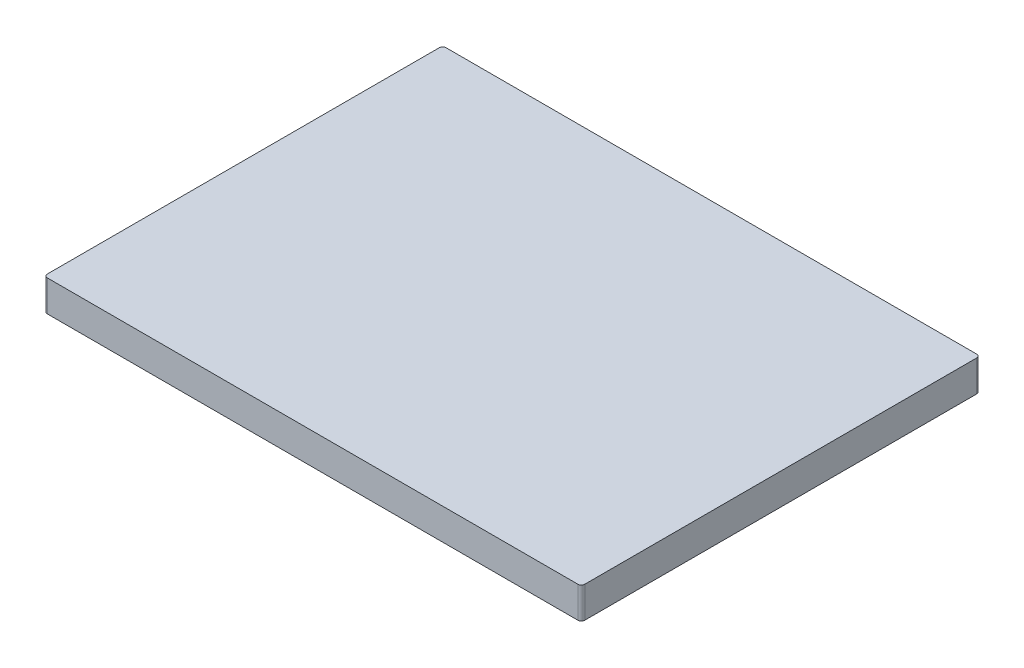
ISO-10303-21;
HEADER;
FILE_DESCRIPTION(('STEP AP214'),'2;1');
FILE_NAME('part.step','',(''),(''),'','','');
FILE_SCHEMA(('AUTOMOTIVE_DESIGN { 1 0 10303 214 1 1 1 1 }'));
ENDSEC;
DATA;
#1=APPLICATION_CONTEXT('core data for automotive mechanical design processes');
#2=APPLICATION_PROTOCOL_DEFINITION('international standard','automotive_design',2000,#1);
#3=PRODUCT_CONTEXT('',#1,'mechanical');
#4=PRODUCT('Part','Part','',(#3));
#5=PRODUCT_RELATED_PRODUCT_CATEGORY('part','',(#4));
#6=PRODUCT_DEFINITION_FORMATION('','',#4);
#7=PRODUCT_DEFINITION_CONTEXT('part definition',#1,'design');
#8=PRODUCT_DEFINITION('design','',#6,#7);
#9=PRODUCT_DEFINITION_SHAPE('','',#8);
#10=(LENGTH_UNIT() NAMED_UNIT(*) SI_UNIT(.MILLI.,.METRE.));
#11=(NAMED_UNIT(*) PLANE_ANGLE_UNIT() SI_UNIT($,.RADIAN.));
#12=(NAMED_UNIT(*) SI_UNIT($,.STERADIAN.) SOLID_ANGLE_UNIT());
#13=UNCERTAINTY_MEASURE_WITH_UNIT(LENGTH_MEASURE(1.E-05),#10,'distance_accuracy_value','');
#14=(GEOMETRIC_REPRESENTATION_CONTEXT(3) GLOBAL_UNCERTAINTY_ASSIGNED_CONTEXT((#13)) GLOBAL_UNIT_ASSIGNED_CONTEXT((#10,
#11,#12)) REPRESENTATION_CONTEXT('',''));
#15=CARTESIAN_POINT('',(0.,0.,0.));
#16=DIRECTION('',(0.,0.,1.));
#17=DIRECTION('',(1.,0.,0.));
#18=AXIS2_PLACEMENT_3D('',#15,#16,#17);
#19=CARTESIAN_POINT('',(71.5,4.,-50.5));
#20=DIRECTION('',(-1.,0.,0.));
#21=DIRECTION('',(0.,0.,1.));
#22=AXIS2_PLACEMENT_3D('',#19,#20,#21);
#23=PLANE('',#22);
#24=DIRECTION('',(0.,0.,-1.));
#25=VECTOR('',#24,1.);
#26=CARTESIAN_POINT('',(71.5,4.,-50.5));
#27=LINE('',#26,#25);
#28=CARTESIAN_POINT('',(71.5,4.,45.5));
#29=VERTEX_POINT('',#28);
#30=CARTESIAN_POINT('',(71.5,4.,-45.5));
#31=VERTEX_POINT('',#30);
#32=EDGE_CURVE('E243',#29,#31,#27,.T.);
#33=ORIENTED_EDGE('',*,*,#32,.F.);
#34=DIRECTION('',(0.,-1.,0.));
#35=VECTOR('',#34,1.);
#36=CARTESIAN_POINT('',(71.5,4.,45.5));
#37=LINE('',#36,#35);
#38=CARTESIAN_POINT('',(71.5,0.,45.5));
#39=VERTEX_POINT('',#38);
#40=EDGE_CURVE('E268',#29,#39,#37,.T.);
#41=ORIENTED_EDGE('',*,*,#40,.T.);
#42=DIRECTION('',(0.,0.,-1.));
#43=VECTOR('',#42,1.);
#44=CARTESIAN_POINT('',(71.5,0.,-50.5));
#45=LINE('',#44,#43);
#46=CARTESIAN_POINT('',(71.5,0.,-45.5));
#47=VERTEX_POINT('',#46);
#48=EDGE_CURVE('E242',#39,#47,#45,.T.);
#49=ORIENTED_EDGE('',*,*,#48,.T.);
#50=DIRECTION('',(0.,-1.,0.));
#51=VECTOR('',#50,1.);
#52=CARTESIAN_POINT('',(71.5,4.,-45.5));
#53=LINE('',#52,#51);
#54=EDGE_CURVE('E256',#47,#31,#53,.F.);
#55=ORIENTED_EDGE('',*,*,#54,.T.);
#56=EDGE_LOOP('',(#33,#41,#49,#55));
#57=FACE_BOUND('',#56,.T.);
#58=ADVANCED_FACE('F35',(#57),#23,.F.);
#59=CARTESIAN_POINT('',(-71.5,4.,-50.5));
#60=DIRECTION('',(0.,0.,1.));
#61=DIRECTION('',(1.,0.,0.));
#62=AXIS2_PLACEMENT_3D('',#59,#60,#61);
#63=PLANE('',#62);
#64=DIRECTION('',(-1.,0.,0.));
#65=VECTOR('',#64,1.);
#66=CARTESIAN_POINT('',(-71.5,4.,-50.5));
#67=LINE('',#66,#65);
#68=CARTESIAN_POINT('',(66.5,4.,-50.5));
#69=VERTEX_POINT('',#68);
#70=CARTESIAN_POINT('',(-66.5,4.,-50.5));
#71=VERTEX_POINT('',#70);
#72=EDGE_CURVE('E246',#69,#71,#67,.T.);
#73=ORIENTED_EDGE('',*,*,#72,.F.);
#74=DIRECTION('',(0.,-1.,0.));
#75=VECTOR('',#74,1.);
#76=CARTESIAN_POINT('',(66.5,4.,-50.5));
#77=LINE('',#76,#75);
#78=CARTESIAN_POINT('',(66.5,0.,-50.5));
#79=VERTEX_POINT('',#78);
#80=EDGE_CURVE('E286',#69,#79,#77,.T.);
#81=ORIENTED_EDGE('',*,*,#80,.T.);
#82=DIRECTION('',(-1.,0.,0.));
#83=VECTOR('',#82,1.);
#84=CARTESIAN_POINT('',(-71.5,0.,-50.5));
#85=LINE('',#84,#83);
#86=CARTESIAN_POINT('',(-66.5,0.,-50.5));
#87=VERTEX_POINT('',#86);
#88=EDGE_CURVE('E259',#79,#87,#85,.T.);
#89=ORIENTED_EDGE('',*,*,#88,.T.);
#90=DIRECTION('',(0.,-1.,0.));
#91=VECTOR('',#90,1.);
#92=CARTESIAN_POINT('',(-66.5,4.,-50.5));
#93=LINE('',#92,#91);
#94=EDGE_CURVE('E284',#87,#71,#93,.F.);
#95=ORIENTED_EDGE('',*,*,#94,.T.);
#96=EDGE_LOOP('',(#73,#81,#89,#95));
#97=FACE_BOUND('',#96,.T.);
#98=ADVANCED_FACE('F367',(#97),#63,.F.);
#99=CARTESIAN_POINT('',(-71.5,4.,-50.5));
#100=DIRECTION('',(1.,0.,0.));
#101=DIRECTION('',(0.,0.,-1.));
#102=AXIS2_PLACEMENT_3D('',#99,#100,#101);
#103=PLANE('',#102);
#104=DIRECTION('',(0.,0.,1.));
#105=VECTOR('',#104,1.);
#106=CARTESIAN_POINT('',(-71.5,4.,-50.5));
#107=LINE('',#106,#105);
#108=CARTESIAN_POINT('',(-71.5,4.,-45.5));
#109=VERTEX_POINT('',#108);
#110=CARTESIAN_POINT('',(-71.5,4.,45.5));
#111=VERTEX_POINT('',#110);
#112=EDGE_CURVE('E250',#109,#111,#107,.T.);
#113=ORIENTED_EDGE('',*,*,#112,.F.);
#114=DIRECTION('',(0.,-1.,0.));
#115=VECTOR('',#114,1.);
#116=CARTESIAN_POINT('',(-71.5,4.,-45.5));
#117=LINE('',#116,#115);
#118=CARTESIAN_POINT('',(-71.5,0.,-45.5));
#119=VERTEX_POINT('',#118);
#120=EDGE_CURVE('E291',#109,#119,#117,.T.);
#121=ORIENTED_EDGE('',*,*,#120,.T.);
#122=DIRECTION('',(0.,0.,1.));
#123=VECTOR('',#122,1.);
#124=CARTESIAN_POINT('',(-71.5,0.,-50.5));
#125=LINE('',#124,#123);
#126=CARTESIAN_POINT('',(-71.5,0.,45.5));
#127=VERTEX_POINT('',#126);
#128=EDGE_CURVE('E262',#119,#127,#125,.T.);
#129=ORIENTED_EDGE('',*,*,#128,.T.);
#130=DIRECTION('',(0.,-1.,0.));
#131=VECTOR('',#130,1.);
#132=CARTESIAN_POINT('',(-71.5,4.,45.5));
#133=LINE('',#132,#131);
#134=EDGE_CURVE('E289',#127,#111,#133,.F.);
#135=ORIENTED_EDGE('',*,*,#134,.T.);
#136=EDGE_LOOP('',(#113,#121,#129,#135));
#137=FACE_BOUND('',#136,.T.);
#138=ADVANCED_FACE('F373',(#137),#103,.F.);
#139=CARTESIAN_POINT('',(-71.5,4.,50.5));
#140=DIRECTION('',(0.,0.,-1.));
#141=DIRECTION('',(-1.,0.,0.));
#142=AXIS2_PLACEMENT_3D('',#139,#140,#141);
#143=PLANE('',#142);
#144=DIRECTION('',(1.,0.,0.));
#145=VECTOR('',#144,1.);
#146=CARTESIAN_POINT('',(-71.5,0.,50.5));
#147=LINE('',#146,#145);
#148=CARTESIAN_POINT('',(-66.5,0.,50.5));
#149=VERTEX_POINT('',#148);
#150=CARTESIAN_POINT('',(66.5,0.,50.5));
#151=VERTEX_POINT('',#150);
#152=EDGE_CURVE('E247',#149,#151,#147,.T.);
#153=ORIENTED_EDGE('',*,*,#152,.T.);
#154=DIRECTION('',(0.,-1.,0.));
#155=VECTOR('',#154,1.);
#156=CARTESIAN_POINT('',(66.5,4.,50.5));
#157=LINE('',#156,#155);
#158=CARTESIAN_POINT('',(66.5,4.,50.5));
#159=VERTEX_POINT('',#158);
#160=EDGE_CURVE('E282',#151,#159,#157,.F.);
#161=ORIENTED_EDGE('',*,*,#160,.T.);
#162=DIRECTION('',(1.,0.,0.));
#163=VECTOR('',#162,1.);
#164=CARTESIAN_POINT('',(-71.5,4.,50.5));
#165=LINE('',#164,#163);
#166=CARTESIAN_POINT('',(-66.5,4.,50.5));
#167=VERTEX_POINT('',#166);
#168=EDGE_CURVE('E253',#167,#159,#165,.T.);
#169=ORIENTED_EDGE('',*,*,#168,.F.);
#170=DIRECTION('',(0.,-1.,0.));
#171=VECTOR('',#170,1.);
#172=CARTESIAN_POINT('',(-66.5,4.,50.5));
#173=LINE('',#172,#171);
#174=EDGE_CURVE('E279',#167,#149,#173,.T.);
#175=ORIENTED_EDGE('',*,*,#174,.T.);
#176=EDGE_LOOP('',(#153,#161,#169,#175));
#177=FACE_BOUND('',#176,.T.);
#178=ADVANCED_FACE('F414',(#177),#143,.F.);
#179=CARTESIAN_POINT('',(0.,0.,0.));
#180=DIRECTION('',(0.,1.,0.));
#181=DIRECTION('',(0.,0.,1.));
#182=AXIS2_PLACEMENT_3D('',#179,#180,#181);
#183=PLANE('',#182);
#184=ORIENTED_EDGE('',*,*,#48,.F.);
#185=CARTESIAN_POINT('',(66.5,0.,45.5));
#186=DIRECTION('',(0.,1.,0.));
#187=DIRECTION('',(0.,0.,1.));
#188=AXIS2_PLACEMENT_3D('',#185,#186,#187);
#189=CIRCLE('',#188,5.);
#190=EDGE_CURVE('E277',#39,#151,#189,.F.);
#191=ORIENTED_EDGE('',*,*,#190,.T.);
#192=ORIENTED_EDGE('',*,*,#152,.F.);
#193=CARTESIAN_POINT('',(-66.5,0.,45.5));
#194=DIRECTION('',(0.,1.,0.));
#195=DIRECTION('',(0.,0.,1.));
#196=AXIS2_PLACEMENT_3D('',#193,#194,#195);
#197=CIRCLE('',#196,5.);
#198=EDGE_CURVE('E271',#149,#127,#197,.F.);
#199=ORIENTED_EDGE('',*,*,#198,.T.);
#200=ORIENTED_EDGE('',*,*,#128,.F.);
#201=CARTESIAN_POINT('',(-66.5,0.,-45.5));
#202=DIRECTION('',(0.,1.,0.));
#203=DIRECTION('',(0.,0.,1.));
#204=AXIS2_PLACEMENT_3D('',#201,#202,#203);
#205=CIRCLE('',#204,5.);
#206=EDGE_CURVE('E273',#119,#87,#205,.F.);
#207=ORIENTED_EDGE('',*,*,#206,.T.);
#208=ORIENTED_EDGE('',*,*,#88,.F.);
#209=CARTESIAN_POINT('',(66.5,0.,-45.5));
#210=DIRECTION('',(0.,1.,0.));
#211=DIRECTION('',(0.,0.,1.));
#212=AXIS2_PLACEMENT_3D('',#209,#210,#211);
#213=CIRCLE('',#212,5.);
#214=EDGE_CURVE('E275',#79,#47,#213,.F.);
#215=ORIENTED_EDGE('',*,*,#214,.T.);
#216=EDGE_LOOP('',(#184,#191,#192,#199,#200,#207,#208,#215));
#217=FACE_BOUND('',#216,.T.);
#218=ADVANCED_FACE('F411',(#217),#183,.F.);
#219=CARTESIAN_POINT('',(0.,4.,0.));
#220=DIRECTION('',(0.,-1.,0.));
#221=DIRECTION('',(0.,0.,-1.));
#222=AXIS2_PLACEMENT_3D('',#219,#220,#221);
#223=PLANE('',#222);
#224=DIRECTION('',(0.,0.,1.));
#225=VECTOR('',#224,1.);
#226=CARTESIAN_POINT('',(75.,4.,-55.));
#227=LINE('',#226,#225);
#228=CARTESIAN_POINT('',(75.,4.,-55.));
#229=VERTEX_POINT('',#228);
#230=CARTESIAN_POINT('',(75.,4.,55.));
#231=VERTEX_POINT('',#230);
#232=EDGE_CURVE('E50',#229,#231,#227,.T.);
#233=ORIENTED_EDGE('',*,*,#232,.T.);
#234=DIRECTION('',(-1.,0.,0.));
#235=VECTOR('',#234,1.);
#236=CARTESIAN_POINT('',(75.,4.,55.));
#237=LINE('',#236,#235);
#238=CARTESIAN_POINT('',(-75.,4.,55.));
#239=VERTEX_POINT('',#238);
#240=EDGE_CURVE('E54',#231,#239,#237,.T.);
#241=ORIENTED_EDGE('',*,*,#240,.T.);
#242=DIRECTION('',(0.,0.,-1.));
#243=VECTOR('',#242,1.);
#244=CARTESIAN_POINT('',(-75.,4.,55.));
#245=LINE('',#244,#243);
#246=CARTESIAN_POINT('',(-75.,4.,-55.));
#247=VERTEX_POINT('',#246);
#248=EDGE_CURVE('E199',#239,#247,#245,.T.);
#249=ORIENTED_EDGE('',*,*,#248,.T.);
#250=DIRECTION('',(1.,0.,0.));
#251=VECTOR('',#250,1.);
#252=CARTESIAN_POINT('',(-75.,4.,-55.));
#253=LINE('',#252,#251);
#254=EDGE_CURVE('E180',#247,#229,#253,.T.);
#255=ORIENTED_EDGE('',*,*,#254,.T.);
#256=EDGE_LOOP('',(#233,#241,#249,#255));
#257=FACE_BOUND('',#256,.T.);
#258=ORIENTED_EDGE('',*,*,#112,.T.);
#259=CARTESIAN_POINT('',(-66.5,4.,45.5));
#260=DIRECTION('',(0.,-1.,0.));
#261=DIRECTION('',(0.,0.,-1.));
#262=AXIS2_PLACEMENT_3D('',#259,#260,#261);
#263=CIRCLE('',#262,5.);
#264=EDGE_CURVE('E300',#111,#167,#263,.F.);
#265=ORIENTED_EDGE('',*,*,#264,.T.);
#266=ORIENTED_EDGE('',*,*,#168,.T.);
#267=CARTESIAN_POINT('',(66.5,4.,45.5));
#268=DIRECTION('',(0.,-1.,0.));
#269=DIRECTION('',(0.,0.,-1.));
#270=AXIS2_PLACEMENT_3D('',#267,#268,#269);
#271=CIRCLE('',#270,5.);
#272=EDGE_CURVE('E294',#159,#29,#271,.F.);
#273=ORIENTED_EDGE('',*,*,#272,.T.);
#274=ORIENTED_EDGE('',*,*,#32,.T.);
#275=CARTESIAN_POINT('',(66.5,4.,-45.5));
#276=DIRECTION('',(0.,-1.,0.));
#277=DIRECTION('',(0.,0.,-1.));
#278=AXIS2_PLACEMENT_3D('',#275,#276,#277);
#279=CIRCLE('',#278,5.);
#280=EDGE_CURVE('E296',#31,#69,#279,.F.);
#281=ORIENTED_EDGE('',*,*,#280,.T.);
#282=ORIENTED_EDGE('',*,*,#72,.T.);
#283=CARTESIAN_POINT('',(-66.5,4.,-45.5));
#284=DIRECTION('',(0.,-1.,0.));
#285=DIRECTION('',(0.,0.,-1.));
#286=AXIS2_PLACEMENT_3D('',#283,#284,#285);
#287=CIRCLE('',#286,5.);
#288=EDGE_CURVE('E298',#71,#109,#287,.F.);
#289=ORIENTED_EDGE('',*,*,#288,.T.);
#290=EDGE_LOOP('',(#258,#265,#266,#273,#274,#281,#282,#289));
#291=FACE_BOUND('',#290,.T.);
#292=ADVANCED_FACE('F383',(#257,#291),#223,.T.);
#293=CARTESIAN_POINT('',(66.5,4.,45.5));
#294=DIRECTION('',(0.,-1.,0.));
#295=DIRECTION('',(0.,0.,-1.));
#296=AXIS2_PLACEMENT_3D('',#293,#294,#295);
#297=CYLINDRICAL_SURFACE('',#296,5.);
#298=ORIENTED_EDGE('',*,*,#272,.F.);
#299=ORIENTED_EDGE('',*,*,#160,.F.);
#300=ORIENTED_EDGE('',*,*,#190,.F.);
#301=ORIENTED_EDGE('',*,*,#40,.F.);
#302=EDGE_LOOP('',(#298,#299,#300,#301));
#303=FACE_BOUND('',#302,.T.);
#304=ADVANCED_FACE('F379',(#303),#297,.T.);
#305=CARTESIAN_POINT('',(66.5,4.,-45.5));
#306=DIRECTION('',(0.,-1.,0.));
#307=DIRECTION('',(0.,0.,-1.));
#308=AXIS2_PLACEMENT_3D('',#305,#306,#307);
#309=CYLINDRICAL_SURFACE('',#308,5.);
#310=ORIENTED_EDGE('',*,*,#280,.F.);
#311=ORIENTED_EDGE('',*,*,#54,.F.);
#312=ORIENTED_EDGE('',*,*,#214,.F.);
#313=ORIENTED_EDGE('',*,*,#80,.F.);
#314=EDGE_LOOP('',(#310,#311,#312,#313));
#315=FACE_BOUND('',#314,.T.);
#316=ADVANCED_FACE('F382',(#315),#309,.T.);
#317=CARTESIAN_POINT('',(-66.5,4.,-45.5));
#318=DIRECTION('',(0.,-1.,0.));
#319=DIRECTION('',(0.,0.,-1.));
#320=AXIS2_PLACEMENT_3D('',#317,#318,#319);
#321=CYLINDRICAL_SURFACE('',#320,5.);
#322=ORIENTED_EDGE('',*,*,#288,.F.);
#323=ORIENTED_EDGE('',*,*,#94,.F.);
#324=ORIENTED_EDGE('',*,*,#206,.F.);
#325=ORIENTED_EDGE('',*,*,#120,.F.);
#326=EDGE_LOOP('',(#322,#323,#324,#325));
#327=FACE_BOUND('',#326,.T.);
#328=ADVANCED_FACE('F387',(#327),#321,.T.);
#329=CARTESIAN_POINT('',(-66.5,4.,45.5));
#330=DIRECTION('',(0.,-1.,0.));
#331=DIRECTION('',(0.,0.,-1.));
#332=AXIS2_PLACEMENT_3D('',#329,#330,#331);
#333=CYLINDRICAL_SURFACE('',#332,5.);
#334=ORIENTED_EDGE('',*,*,#264,.F.);
#335=ORIENTED_EDGE('',*,*,#134,.F.);
#336=ORIENTED_EDGE('',*,*,#198,.F.);
#337=ORIENTED_EDGE('',*,*,#174,.F.);
#338=EDGE_LOOP('',(#334,#335,#336,#337));
#339=FACE_BOUND('',#338,.T.);
#340=ADVANCED_FACE('F391',(#339),#333,.T.);
#341=CARTESIAN_POINT('',(76.5,-1.,56.5));
#342=DIRECTION('',(0.,-1.,0.));
#343=DIRECTION('',(0.,0.,-1.));
#344=AXIS2_PLACEMENT_3D('',#341,#342,#343);
#345=PLANE('',#344);
#346=CARTESIAN_POINT('',(76.5,-1.,56.5));
#347=DIRECTION('',(0.,-1.,0.));
#348=DIRECTION('',(0.,0.,-1.));
#349=AXIS2_PLACEMENT_3D('',#346,#347,#348);
#350=CIRCLE('',#349,1.);
#351=CARTESIAN_POINT('',(77.5,-1.,56.5));
#352=VERTEX_POINT('',#351);
#353=CARTESIAN_POINT('',(76.5,-1.,57.5));
#354=VERTEX_POINT('',#353);
#355=EDGE_CURVE('E185',#352,#354,#350,.T.);
#356=ORIENTED_EDGE('',*,*,#355,.T.);
#357=DIRECTION('',(-1.,0.,0.));
#358=VECTOR('',#357,1.);
#359=CARTESIAN_POINT('',(76.5,-1.,57.5));
#360=LINE('',#359,#358);
#361=CARTESIAN_POINT('',(-76.5,-1.,57.5));
#362=VERTEX_POINT('',#361);
#363=EDGE_CURVE('E209',#354,#362,#360,.T.);
#364=ORIENTED_EDGE('',*,*,#363,.T.);
#365=CARTESIAN_POINT('',(-76.5,-1.,56.5));
#366=DIRECTION('',(0.,-1.,0.));
#367=DIRECTION('',(0.,0.,-1.));
#368=AXIS2_PLACEMENT_3D('',#365,#366,#367);
#369=CIRCLE('',#368,0.999999999999994);
#370=CARTESIAN_POINT('',(-77.5,-1.,56.5));
#371=VERTEX_POINT('',#370);
#372=EDGE_CURVE('E212',#362,#371,#369,.T.);
#373=ORIENTED_EDGE('',*,*,#372,.T.);
#374=DIRECTION('',(0.,0.,-1.));
#375=VECTOR('',#374,1.);
#376=CARTESIAN_POINT('',(-77.5,-1.,56.5));
#377=LINE('',#376,#375);
#378=CARTESIAN_POINT('',(-77.5,-1.,-56.5));
#379=VERTEX_POINT('',#378);
#380=EDGE_CURVE('E215',#371,#379,#377,.T.);
#381=ORIENTED_EDGE('',*,*,#380,.T.);
#382=CARTESIAN_POINT('',(-76.5,-1.,-56.5));
#383=DIRECTION('',(0.,-1.,0.));
#384=DIRECTION('',(0.,0.,-1.));
#385=AXIS2_PLACEMENT_3D('',#382,#383,#384);
#386=CIRCLE('',#385,1.);
#387=CARTESIAN_POINT('',(-76.5,-1.,-57.5));
#388=VERTEX_POINT('',#387);
#389=EDGE_CURVE('E218',#379,#388,#386,.T.);
#390=ORIENTED_EDGE('',*,*,#389,.T.);
#391=DIRECTION('',(1.,0.,0.));
#392=VECTOR('',#391,1.);
#393=CARTESIAN_POINT('',(-76.5,-1.,-57.5));
#394=LINE('',#393,#392);
#395=CARTESIAN_POINT('',(76.5,-1.,-57.5));
#396=VERTEX_POINT('',#395);
#397=EDGE_CURVE('E221',#388,#396,#394,.T.);
#398=ORIENTED_EDGE('',*,*,#397,.T.);
#399=CARTESIAN_POINT('',(76.5,-1.,-56.5));
#400=DIRECTION('',(0.,-1.,0.));
#401=DIRECTION('',(0.,0.,-1.));
#402=AXIS2_PLACEMENT_3D('',#399,#400,#401);
#403=CIRCLE('',#402,1.);
#404=CARTESIAN_POINT('',(77.5,-1.,-56.5));
#405=VERTEX_POINT('',#404);
#406=EDGE_CURVE('E224',#396,#405,#403,.T.);
#407=ORIENTED_EDGE('',*,*,#406,.T.);
#408=DIRECTION('',(0.,0.,1.));
#409=VECTOR('',#408,1.);
#410=CARTESIAN_POINT('',(77.5,-1.,-56.5));
#411=LINE('',#410,#409);
#412=EDGE_CURVE('E227',#405,#352,#411,.T.);
#413=ORIENTED_EDGE('',*,*,#412,.T.);
#414=EDGE_LOOP('',(#356,#364,#373,#381,#390,#398,#407,#413));
#415=FACE_BOUND('',#414,.T.);
#416=DIRECTION('',(-1.,0.,0.));
#417=VECTOR('',#416,1.);
#418=CARTESIAN_POINT('',(75.,-1.,55.));
#419=LINE('',#418,#417);
#420=CARTESIAN_POINT('',(75.,-1.,55.));
#421=VERTEX_POINT('',#420);
#422=CARTESIAN_POINT('',(-75.,-1.,55.));
#423=VERTEX_POINT('',#422);
#424=EDGE_CURVE('E179',#421,#423,#419,.T.);
#425=ORIENTED_EDGE('',*,*,#424,.F.);
#426=DIRECTION('',(0.,0.,1.));
#427=VECTOR('',#426,1.);
#428=CARTESIAN_POINT('',(75.,-1.,-55.));
#429=LINE('',#428,#427);
#430=CARTESIAN_POINT('',(75.,-1.,-55.));
#431=VERTEX_POINT('',#430);
#432=EDGE_CURVE('E170',#431,#421,#429,.T.);
#433=ORIENTED_EDGE('',*,*,#432,.F.);
#434=DIRECTION('',(1.,0.,0.));
#435=VECTOR('',#434,1.);
#436=CARTESIAN_POINT('',(-75.,-1.,-55.));
#437=LINE('',#436,#435);
#438=CARTESIAN_POINT('',(-75.,-1.,-55.));
#439=VERTEX_POINT('',#438);
#440=EDGE_CURVE('E193',#439,#431,#437,.T.);
#441=ORIENTED_EDGE('',*,*,#440,.F.);
#442=DIRECTION('',(0.,0.,-1.));
#443=VECTOR('',#442,1.);
#444=CARTESIAN_POINT('',(-75.,-1.,55.));
#445=LINE('',#444,#443);
#446=EDGE_CURVE('E191',#423,#439,#445,.T.);
#447=ORIENTED_EDGE('',*,*,#446,.F.);
#448=EDGE_LOOP('',(#425,#433,#441,#447));
#449=FACE_BOUND('',#448,.T.);
#450=ADVANCED_FACE('F189',(#415,#449),#345,.T.);
#451=CARTESIAN_POINT('',(75.,-1.,-55.));
#452=DIRECTION('',(-1.,0.,0.));
#453=DIRECTION('',(0.,0.,1.));
#454=AXIS2_PLACEMENT_3D('',#451,#452,#453);
#455=PLANE('',#454);
#456=ORIENTED_EDGE('',*,*,#232,.F.);
#457=DIRECTION('',(0.,1.,0.));
#458=VECTOR('',#457,1.);
#459=CARTESIAN_POINT('',(75.,-1.,-55.));
#460=LINE('',#459,#458);
#461=EDGE_CURVE('E175',#431,#229,#460,.T.);
#462=ORIENTED_EDGE('',*,*,#461,.F.);
#463=ORIENTED_EDGE('',*,*,#432,.T.);
#464=DIRECTION('',(0.,1.,0.));
#465=VECTOR('',#464,1.);
#466=CARTESIAN_POINT('',(75.,-1.,55.));
#467=LINE('',#466,#465);
#468=EDGE_CURVE('E173',#421,#231,#467,.T.);
#469=ORIENTED_EDGE('',*,*,#468,.T.);
#470=EDGE_LOOP('',(#456,#462,#463,#469));
#471=FACE_BOUND('',#470,.T.);
#472=ADVANCED_FACE('F172',(#471),#455,.T.);
#473=CARTESIAN_POINT('',(75.,-1.,55.));
#474=DIRECTION('',(0.,0.,-1.));
#475=DIRECTION('',(-1.,0.,0.));
#476=AXIS2_PLACEMENT_3D('',#473,#474,#475);
#477=PLANE('',#476);
#478=ORIENTED_EDGE('',*,*,#240,.F.);
#479=ORIENTED_EDGE('',*,*,#468,.F.);
#480=ORIENTED_EDGE('',*,*,#424,.T.);
#481=DIRECTION('',(0.,1.,0.));
#482=VECTOR('',#481,1.);
#483=CARTESIAN_POINT('',(-75.,-1.,55.));
#484=LINE('',#483,#482);
#485=EDGE_CURVE('E186',#423,#239,#484,.T.);
#486=ORIENTED_EDGE('',*,*,#485,.T.);
#487=EDGE_LOOP('',(#478,#479,#480,#486));
#488=FACE_BOUND('',#487,.T.);
#489=ADVANCED_FACE('F183',(#488),#477,.T.);
#490=CARTESIAN_POINT('',(-75.,-1.,55.));
#491=DIRECTION('',(1.,0.,0.));
#492=DIRECTION('',(0.,0.,-1.));
#493=AXIS2_PLACEMENT_3D('',#490,#491,#492);
#494=PLANE('',#493);
#495=ORIENTED_EDGE('',*,*,#248,.F.);
#496=ORIENTED_EDGE('',*,*,#485,.F.);
#497=ORIENTED_EDGE('',*,*,#446,.T.);
#498=DIRECTION('',(0.,1.,0.));
#499=VECTOR('',#498,1.);
#500=CARTESIAN_POINT('',(-75.,-1.,-55.));
#501=LINE('',#500,#499);
#502=EDGE_CURVE('E203',#439,#247,#501,.T.);
#503=ORIENTED_EDGE('',*,*,#502,.T.);
#504=EDGE_LOOP('',(#495,#496,#497,#503));
#505=FACE_BOUND('',#504,.T.);
#506=ADVANCED_FACE('F482',(#505),#494,.T.);
#507=CARTESIAN_POINT('',(-75.,-1.,-55.));
#508=DIRECTION('',(0.,0.,1.));
#509=DIRECTION('',(1.,0.,0.));
#510=AXIS2_PLACEMENT_3D('',#507,#508,#509);
#511=PLANE('',#510);
#512=ORIENTED_EDGE('',*,*,#254,.F.);
#513=ORIENTED_EDGE('',*,*,#502,.F.);
#514=ORIENTED_EDGE('',*,*,#440,.T.);
#515=ORIENTED_EDGE('',*,*,#461,.T.);
#516=EDGE_LOOP('',(#512,#513,#514,#515));
#517=FACE_BOUND('',#516,.T.);
#518=ADVANCED_FACE('F489',(#517),#511,.T.);
#519=CARTESIAN_POINT('',(0.,8.,0.));
#520=DIRECTION('',(0.,-1.,0.));
#521=DIRECTION('',(0.,0.,-1.));
#522=AXIS2_PLACEMENT_3D('',#519,#520,#521);
#523=PLANE('',#522);
#524=DIRECTION('',(0.,0.,1.));
#525=VECTOR('',#524,1.);
#526=CARTESIAN_POINT('',(-77.5,8.,-57.5));
#527=LINE('',#526,#525);
#528=CARTESIAN_POINT('',(-77.5,8.,-56.5));
#529=VERTEX_POINT('',#528);
#530=CARTESIAN_POINT('',(-77.5,8.,56.5));
#531=VERTEX_POINT('',#530);
#532=EDGE_CURVE('E230',#529,#531,#527,.T.);
#533=ORIENTED_EDGE('',*,*,#532,.T.);
#534=CARTESIAN_POINT('',(-76.5,8.,56.5));
#535=DIRECTION('',(0.,-1.,0.));
#536=DIRECTION('',(0.,0.,-1.));
#537=AXIS2_PLACEMENT_3D('',#534,#535,#536);
#538=CIRCLE('',#537,1.);
#539=CARTESIAN_POINT('',(-76.5,8.,57.5));
#540=VERTEX_POINT('',#539);
#541=EDGE_CURVE('E316',#531,#540,#538,.F.);
#542=ORIENTED_EDGE('',*,*,#541,.T.);
#543=DIRECTION('',(1.,0.,0.));
#544=VECTOR('',#543,1.);
#545=CARTESIAN_POINT('',(77.5,8.,57.5));
#546=LINE('',#545,#544);
#547=CARTESIAN_POINT('',(76.5,8.,57.5));
#548=VERTEX_POINT('',#547);
#549=EDGE_CURVE('E233',#540,#548,#546,.T.);
#550=ORIENTED_EDGE('',*,*,#549,.T.);
#551=CARTESIAN_POINT('',(76.5,8.,56.5));
#552=DIRECTION('',(0.,-1.,0.));
#553=DIRECTION('',(0.,0.,-1.));
#554=AXIS2_PLACEMENT_3D('',#551,#552,#553);
#555=CIRCLE('',#554,1.);
#556=CARTESIAN_POINT('',(77.5,8.,56.5));
#557=VERTEX_POINT('',#556);
#558=EDGE_CURVE('E310',#548,#557,#555,.F.);
#559=ORIENTED_EDGE('',*,*,#558,.T.);
#560=DIRECTION('',(0.,0.,-1.));
#561=VECTOR('',#560,1.);
#562=CARTESIAN_POINT('',(77.5,8.,-57.5));
#563=LINE('',#562,#561);
#564=CARTESIAN_POINT('',(77.5,8.,-56.5));
#565=VERTEX_POINT('',#564);
#566=EDGE_CURVE('E236',#557,#565,#563,.T.);
#567=ORIENTED_EDGE('',*,*,#566,.T.);
#568=CARTESIAN_POINT('',(76.5,8.,-56.5));
#569=DIRECTION('',(0.,-1.,0.));
#570=DIRECTION('',(0.,0.,-1.));
#571=AXIS2_PLACEMENT_3D('',#568,#569,#570);
#572=CIRCLE('',#571,1.);
#573=CARTESIAN_POINT('',(76.5,8.,-57.5));
#574=VERTEX_POINT('',#573);
#575=EDGE_CURVE('E312',#565,#574,#572,.F.);
#576=ORIENTED_EDGE('',*,*,#575,.T.);
#577=DIRECTION('',(-1.,0.,0.));
#578=VECTOR('',#577,1.);
#579=CARTESIAN_POINT('',(77.5,8.,-57.5));
#580=LINE('',#579,#578);
#581=CARTESIAN_POINT('',(-76.5,8.,-57.5));
#582=VERTEX_POINT('',#581);
#583=EDGE_CURVE('E239',#574,#582,#580,.T.);
#584=ORIENTED_EDGE('',*,*,#583,.T.);
#585=CARTESIAN_POINT('',(-76.5,8.,-56.5));
#586=DIRECTION('',(0.,-1.,0.));
#587=DIRECTION('',(0.,0.,-1.));
#588=AXIS2_PLACEMENT_3D('',#585,#586,#587);
#589=CIRCLE('',#588,1.);
#590=EDGE_CURVE('E314',#582,#529,#589,.F.);
#591=ORIENTED_EDGE('',*,*,#590,.T.);
#592=EDGE_LOOP('',(#533,#542,#550,#559,#567,#576,#584,#591));
#593=FACE_BOUND('',#592,.T.);
#594=ADVANCED_FACE('F346',(#593),#523,.F.);
#595=CARTESIAN_POINT('',(76.5,8.,56.5));
#596=DIRECTION('',(0.,-1.,0.));
#597=DIRECTION('',(0.,0.,-1.));
#598=AXIS2_PLACEMENT_3D('',#595,#596,#597);
#599=CYLINDRICAL_SURFACE('',#598,1.);
#600=ORIENTED_EDGE('',*,*,#558,.F.);
#601=DIRECTION('',(0.,-1.,0.));
#602=VECTOR('',#601,1.);
#603=CARTESIAN_POINT('',(76.5,8.,57.5));
#604=LINE('',#603,#602);
#605=EDGE_CURVE('E302',#354,#548,#604,.F.);
#606=ORIENTED_EDGE('',*,*,#605,.F.);
#607=ORIENTED_EDGE('',*,*,#355,.F.);
#608=DIRECTION('',(0.,-1.,0.));
#609=VECTOR('',#608,1.);
#610=CARTESIAN_POINT('',(77.5,8.,56.5));
#611=LINE('',#610,#609);
#612=EDGE_CURVE('E43',#557,#352,#611,.T.);
#613=ORIENTED_EDGE('',*,*,#612,.F.);
#614=EDGE_LOOP('',(#600,#606,#607,#613));
#615=FACE_BOUND('',#614,.T.);
#616=ADVANCED_FACE('F37',(#615),#599,.T.);
#617=CARTESIAN_POINT('',(76.5,8.,-56.5));
#618=DIRECTION('',(0.,-1.,0.));
#619=DIRECTION('',(0.,0.,-1.));
#620=AXIS2_PLACEMENT_3D('',#617,#618,#619);
#621=CYLINDRICAL_SURFACE('',#620,1.);
#622=ORIENTED_EDGE('',*,*,#575,.F.);
#623=DIRECTION('',(0.,-1.,0.));
#624=VECTOR('',#623,1.);
#625=CARTESIAN_POINT('',(77.5,8.,-56.5));
#626=LINE('',#625,#624);
#627=EDGE_CURVE('E11',#405,#565,#626,.F.);
#628=ORIENTED_EDGE('',*,*,#627,.F.);
#629=ORIENTED_EDGE('',*,*,#406,.F.);
#630=DIRECTION('',(0.,-1.,0.));
#631=VECTOR('',#630,1.);
#632=CARTESIAN_POINT('',(76.5,8.,-57.5));
#633=LINE('',#632,#631);
#634=EDGE_CURVE('E318',#574,#396,#633,.T.);
#635=ORIENTED_EDGE('',*,*,#634,.F.);
#636=EDGE_LOOP('',(#622,#628,#629,#635));
#637=FACE_BOUND('',#636,.T.);
#638=ADVANCED_FACE('F358',(#637),#621,.T.);
#639=CARTESIAN_POINT('',(77.5,8.,-57.5));
#640=DIRECTION('',(-1.,0.,0.));
#641=DIRECTION('',(0.,0.,1.));
#642=AXIS2_PLACEMENT_3D('',#639,#640,#641);
#643=PLANE('',#642);
#644=ORIENTED_EDGE('',*,*,#612,.T.);
#645=ORIENTED_EDGE('',*,*,#412,.F.);
#646=ORIENTED_EDGE('',*,*,#627,.T.);
#647=ORIENTED_EDGE('',*,*,#566,.F.);
#648=EDGE_LOOP('',(#644,#645,#646,#647));
#649=FACE_BOUND('',#648,.T.);
#650=ADVANCED_FACE('F325',(#649),#643,.F.);
#651=CARTESIAN_POINT('',(-76.5,8.,-56.5));
#652=DIRECTION('',(0.,-1.,0.));
#653=DIRECTION('',(0.,0.,-1.));
#654=AXIS2_PLACEMENT_3D('',#651,#652,#653);
#655=CYLINDRICAL_SURFACE('',#654,1.);
#656=ORIENTED_EDGE('',*,*,#590,.F.);
#657=DIRECTION('',(0.,-1.,0.));
#658=VECTOR('',#657,1.);
#659=CARTESIAN_POINT('',(-76.5,8.,-57.5));
#660=LINE('',#659,#658);
#661=EDGE_CURVE('E320',#388,#582,#660,.F.);
#662=ORIENTED_EDGE('',*,*,#661,.F.);
#663=ORIENTED_EDGE('',*,*,#389,.F.);
#664=DIRECTION('',(0.,-1.,0.));
#665=VECTOR('',#664,1.);
#666=CARTESIAN_POINT('',(-77.5,8.,-56.5));
#667=LINE('',#666,#665);
#668=EDGE_CURVE('E306',#529,#379,#667,.T.);
#669=ORIENTED_EDGE('',*,*,#668,.F.);
#670=EDGE_LOOP('',(#656,#662,#663,#669));
#671=FACE_BOUND('',#670,.T.);
#672=ADVANCED_FACE('F350',(#671),#655,.T.);
#673=CARTESIAN_POINT('',(77.5,8.,-57.5));
#674=DIRECTION('',(0.,0.,1.));
#675=DIRECTION('',(1.,0.,0.));
#676=AXIS2_PLACEMENT_3D('',#673,#674,#675);
#677=PLANE('',#676);
#678=ORIENTED_EDGE('',*,*,#634,.T.);
#679=ORIENTED_EDGE('',*,*,#397,.F.);
#680=ORIENTED_EDGE('',*,*,#661,.T.);
#681=ORIENTED_EDGE('',*,*,#583,.F.);
#682=EDGE_LOOP('',(#678,#679,#680,#681));
#683=FACE_BOUND('',#682,.T.);
#684=ADVANCED_FACE('F354',(#683),#677,.F.);
#685=CARTESIAN_POINT('',(-76.5,8.,56.5));
#686=DIRECTION('',(0.,-1.,0.));
#687=DIRECTION('',(0.,0.,-1.));
#688=AXIS2_PLACEMENT_3D('',#685,#686,#687);
#689=CYLINDRICAL_SURFACE('',#688,1.);
#690=ORIENTED_EDGE('',*,*,#541,.F.);
#691=DIRECTION('',(0.,-1.,0.));
#692=VECTOR('',#691,1.);
#693=CARTESIAN_POINT('',(-77.5,8.,56.5));
#694=LINE('',#693,#692);
#695=EDGE_CURVE('E308',#371,#531,#694,.F.);
#696=ORIENTED_EDGE('',*,*,#695,.F.);
#697=ORIENTED_EDGE('',*,*,#372,.F.);
#698=DIRECTION('',(0.,-1.,0.));
#699=VECTOR('',#698,1.);
#700=CARTESIAN_POINT('',(-76.5,8.,57.5));
#701=LINE('',#700,#699);
#702=EDGE_CURVE('E304',#540,#362,#701,.T.);
#703=ORIENTED_EDGE('',*,*,#702,.F.);
#704=EDGE_LOOP('',(#690,#696,#697,#703));
#705=FACE_BOUND('',#704,.T.);
#706=ADVANCED_FACE('F340',(#705),#689,.T.);
#707=CARTESIAN_POINT('',(-77.5,8.,-57.5));
#708=DIRECTION('',(1.,0.,0.));
#709=DIRECTION('',(0.,0.,-1.));
#710=AXIS2_PLACEMENT_3D('',#707,#708,#709);
#711=PLANE('',#710);
#712=ORIENTED_EDGE('',*,*,#668,.T.);
#713=ORIENTED_EDGE('',*,*,#380,.F.);
#714=ORIENTED_EDGE('',*,*,#695,.T.);
#715=ORIENTED_EDGE('',*,*,#532,.F.);
#716=EDGE_LOOP('',(#712,#713,#714,#715));
#717=FACE_BOUND('',#716,.T.);
#718=ADVANCED_FACE('F343',(#717),#711,.F.);
#719=CARTESIAN_POINT('',(77.5,8.,57.5));
#720=DIRECTION('',(0.,0.,-1.));
#721=DIRECTION('',(-1.,0.,0.));
#722=AXIS2_PLACEMENT_3D('',#719,#720,#721);
#723=PLANE('',#722);
#724=ORIENTED_EDGE('',*,*,#549,.F.);
#725=ORIENTED_EDGE('',*,*,#702,.T.);
#726=ORIENTED_EDGE('',*,*,#363,.F.);
#727=ORIENTED_EDGE('',*,*,#605,.T.);
#728=EDGE_LOOP('',(#724,#725,#726,#727));
#729=FACE_BOUND('',#728,.T.);
#730=ADVANCED_FACE('F334',(#729),#723,.F.);
#731=CLOSED_SHELL('',(#58,#98,#138,#178,#218,#292,#304,#316,#328,#340,#450,#472,#489,#506,#518,
#594,#616,#638,#650,#672,#684,#706,#718,#730));
#732=MANIFOLD_SOLID_BREP('B2',#731);
#733=ADVANCED_BREP_SHAPE_REPRESENTATION('',(#18,#732),#14);
#734=SHAPE_DEFINITION_REPRESENTATION(#9,#733);
ENDSEC;
END-ISO-10303-21;
